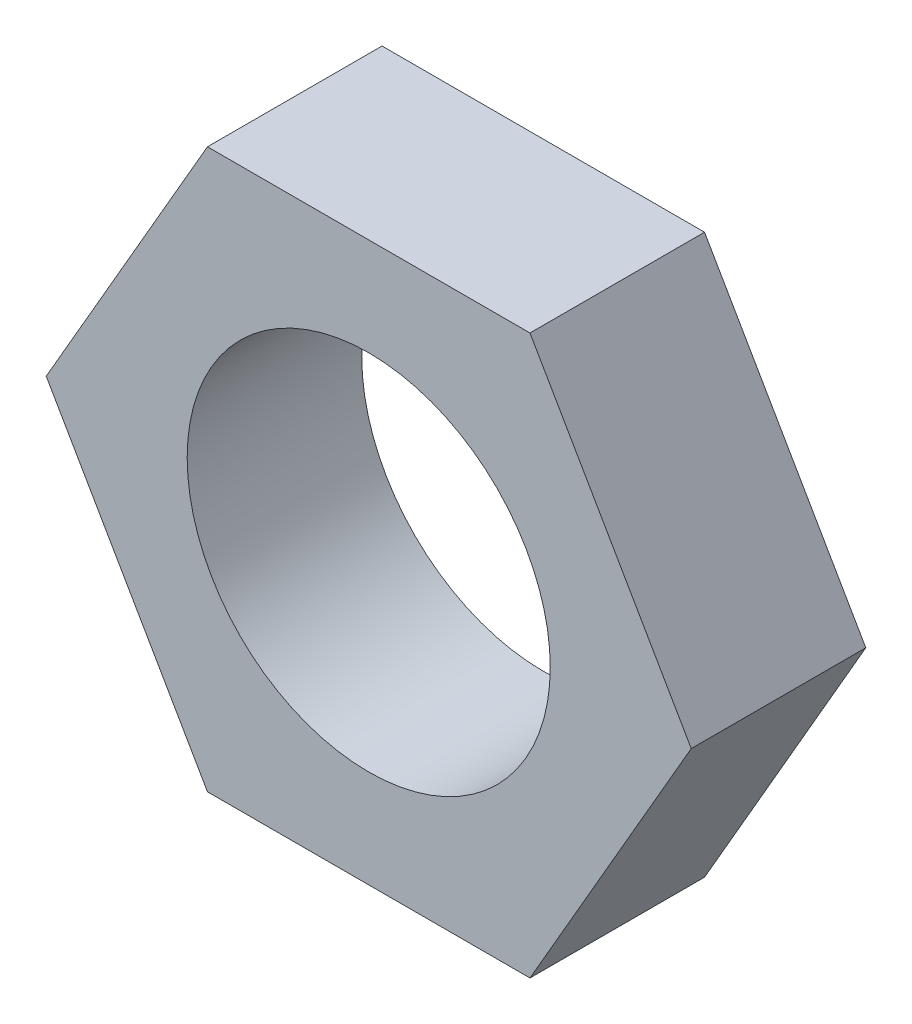
ISO-10303-21;
HEADER;
FILE_DESCRIPTION(('STEP AP214'),'2;1');
FILE_NAME('part.step','',(''),(''),'','','');
FILE_SCHEMA(('AUTOMOTIVE_DESIGN { 1 0 10303 214 1 1 1 1 }'));
ENDSEC;
DATA;
#1=APPLICATION_CONTEXT('core data for automotive mechanical design processes');
#2=APPLICATION_PROTOCOL_DEFINITION('international standard','automotive_design',2000,#1);
#3=PRODUCT_CONTEXT('',#1,'mechanical');
#4=PRODUCT('Part','Part','',(#3));
#5=PRODUCT_RELATED_PRODUCT_CATEGORY('part','',(#4));
#6=PRODUCT_DEFINITION_FORMATION('','',#4);
#7=PRODUCT_DEFINITION_CONTEXT('part definition',#1,'design');
#8=PRODUCT_DEFINITION('design','',#6,#7);
#9=PRODUCT_DEFINITION_SHAPE('','',#8);
#10=(LENGTH_UNIT() NAMED_UNIT(*) SI_UNIT(.MILLI.,.METRE.));
#11=(NAMED_UNIT(*) PLANE_ANGLE_UNIT() SI_UNIT($,.RADIAN.));
#12=(NAMED_UNIT(*) SI_UNIT($,.STERADIAN.) SOLID_ANGLE_UNIT());
#13=UNCERTAINTY_MEASURE_WITH_UNIT(LENGTH_MEASURE(1.E-05),#10,'distance_accuracy_value','');
#14=(GEOMETRIC_REPRESENTATION_CONTEXT(3) GLOBAL_UNCERTAINTY_ASSIGNED_CONTEXT((#13)) GLOBAL_UNIT_ASSIGNED_CONTEXT((#10,
#11,#12)) REPRESENTATION_CONTEXT('',''));
#15=CARTESIAN_POINT('',(0.,0.,0.));
#16=DIRECTION('',(0.,0.,1.));
#17=DIRECTION('',(1.,0.,0.));
#18=AXIS2_PLACEMENT_3D('',#15,#16,#17);
#19=CARTESIAN_POINT('',(0.,0.,2.5));
#20=DIRECTION('',(0.,0.,1.));
#21=DIRECTION('',(1.,0.,0.));
#22=AXIS2_PLACEMENT_3D('',#19,#20,#21);
#23=PLANE('',#22);
#24=DIRECTION('',(0.5,0.866025403784439,0.));
#25=VECTOR('',#24,1.);
#26=CARTESIAN_POINT('',(2.3094010767585,-4.,2.5));
#27=LINE('',#26,#25);
#28=CARTESIAN_POINT('',(2.3094010767585,-4.,2.5));
#29=VERTEX_POINT('',#28);
#30=CARTESIAN_POINT('',(4.61880215351701,0.,2.5));
#31=VERTEX_POINT('',#30);
#32=EDGE_CURVE('E137',#29,#31,#27,.T.);
#33=ORIENTED_EDGE('',*,*,#32,.T.);
#34=DIRECTION('',(-0.5,0.866025403784439,0.));
#35=VECTOR('',#34,1.);
#36=CARTESIAN_POINT('',(4.61880215351701,0.,2.5));
#37=LINE('',#36,#35);
#38=CARTESIAN_POINT('',(2.3094010767585,4.,2.5));
#39=VERTEX_POINT('',#38);
#40=EDGE_CURVE('E95',#31,#39,#37,.T.);
#41=ORIENTED_EDGE('',*,*,#40,.T.);
#42=DIRECTION('',(-1.,0.,0.));
#43=VECTOR('',#42,1.);
#44=CARTESIAN_POINT('',(2.3094010767585,4.,2.5));
#45=LINE('',#44,#43);
#46=CARTESIAN_POINT('',(-2.3094010767585,4.,2.5));
#47=VERTEX_POINT('',#46);
#48=EDGE_CURVE('E108',#39,#47,#45,.T.);
#49=ORIENTED_EDGE('',*,*,#48,.T.);
#50=DIRECTION('',(-0.5,-0.866025403784439,0.));
#51=VECTOR('',#50,1.);
#52=CARTESIAN_POINT('',(-2.3094010767585,4.,2.5));
#53=LINE('',#52,#51);
#54=CARTESIAN_POINT('',(-4.61880215351701,0.,2.5));
#55=VERTEX_POINT('',#54);
#56=EDGE_CURVE('E102',#47,#55,#53,.T.);
#57=ORIENTED_EDGE('',*,*,#56,.T.);
#58=DIRECTION('',(0.5,-0.866025403784439,0.));
#59=VECTOR('',#58,1.);
#60=CARTESIAN_POINT('',(-4.61880215351701,0.,2.5));
#61=LINE('',#60,#59);
#62=CARTESIAN_POINT('',(-2.30940107675851,-4.,2.5));
#63=VERTEX_POINT('',#62);
#64=EDGE_CURVE('E106',#55,#63,#61,.T.);
#65=ORIENTED_EDGE('',*,*,#64,.T.);
#66=DIRECTION('',(1.,0.,0.));
#67=VECTOR('',#66,1.);
#68=CARTESIAN_POINT('',(-2.30940107675851,-4.,2.5));
#69=LINE('',#68,#67);
#70=EDGE_CURVE('E58',#63,#29,#69,.T.);
#71=ORIENTED_EDGE('',*,*,#70,.T.);
#72=EDGE_LOOP('',(#33,#41,#49,#57,#65,#71));
#73=FACE_BOUND('',#72,.T.);
#74=CARTESIAN_POINT('',(0.,0.,2.5));
#75=DIRECTION('',(0.,0.,1.));
#76=DIRECTION('',(1.,0.,0.));
#77=AXIS2_PLACEMENT_3D('',#74,#75,#76);
#78=CIRCLE('',#77,2.6);
#79=CARTESIAN_POINT('',(2.6,0.,2.5));
#80=VERTEX_POINT('',#79);
#81=EDGE_CURVE('E130',#80,#80,#78,.T.);
#82=ORIENTED_EDGE('',*,*,#81,.F.);
#83=EDGE_LOOP('',(#82));
#84=FACE_BOUND('',#83,.T.);
#85=ADVANCED_FACE('F41',(#73,#84),#23,.T.);
#86=CARTESIAN_POINT('',(0.,0.,0.));
#87=DIRECTION('',(0.,0.,1.));
#88=DIRECTION('',(1.,0.,0.));
#89=AXIS2_PLACEMENT_3D('',#86,#87,#88);
#90=PLANE('',#89);
#91=DIRECTION('',(0.5,0.866025403784439,0.));
#92=VECTOR('',#91,1.);
#93=CARTESIAN_POINT('',(2.3094010767585,-4.,0.));
#94=LINE('',#93,#92);
#95=CARTESIAN_POINT('',(2.3094010767585,-4.,0.));
#96=VERTEX_POINT('',#95);
#97=CARTESIAN_POINT('',(4.61880215351701,0.,0.));
#98=VERTEX_POINT('',#97);
#99=EDGE_CURVE('E126',#96,#98,#94,.T.);
#100=ORIENTED_EDGE('',*,*,#99,.F.);
#101=DIRECTION('',(1.,0.,0.));
#102=VECTOR('',#101,1.);
#103=CARTESIAN_POINT('',(-2.30940107675851,-4.,0.));
#104=LINE('',#103,#102);
#105=CARTESIAN_POINT('',(-2.30940107675851,-4.,0.));
#106=VERTEX_POINT('',#105);
#107=EDGE_CURVE('E87',#106,#96,#104,.T.);
#108=ORIENTED_EDGE('',*,*,#107,.F.);
#109=DIRECTION('',(0.5,-0.866025403784439,0.));
#110=VECTOR('',#109,1.);
#111=CARTESIAN_POINT('',(-4.61880215351701,0.,0.));
#112=LINE('',#111,#110);
#113=CARTESIAN_POINT('',(-4.61880215351701,0.,0.));
#114=VERTEX_POINT('',#113);
#115=EDGE_CURVE('E81',#114,#106,#112,.T.);
#116=ORIENTED_EDGE('',*,*,#115,.F.);
#117=DIRECTION('',(-0.5,-0.866025403784439,0.));
#118=VECTOR('',#117,1.);
#119=CARTESIAN_POINT('',(-2.3094010767585,4.,0.));
#120=LINE('',#119,#118);
#121=CARTESIAN_POINT('',(-2.3094010767585,4.,0.));
#122=VERTEX_POINT('',#121);
#123=EDGE_CURVE('E116',#122,#114,#120,.T.);
#124=ORIENTED_EDGE('',*,*,#123,.F.);
#125=DIRECTION('',(-1.,0.,0.));
#126=VECTOR('',#125,1.);
#127=CARTESIAN_POINT('',(2.3094010767585,4.,0.));
#128=LINE('',#127,#126);
#129=CARTESIAN_POINT('',(2.3094010767585,4.,0.));
#130=VERTEX_POINT('',#129);
#131=EDGE_CURVE('E132',#130,#122,#128,.T.);
#132=ORIENTED_EDGE('',*,*,#131,.F.);
#133=DIRECTION('',(-0.5,0.866025403784439,0.));
#134=VECTOR('',#133,1.);
#135=CARTESIAN_POINT('',(4.61880215351701,0.,0.));
#136=LINE('',#135,#134);
#137=EDGE_CURVE('E129',#98,#130,#136,.T.);
#138=ORIENTED_EDGE('',*,*,#137,.F.);
#139=EDGE_LOOP('',(#100,#108,#116,#124,#132,#138));
#140=FACE_BOUND('',#139,.T.);
#141=CARTESIAN_POINT('',(0.,0.,0.));
#142=DIRECTION('',(0.,0.,1.));
#143=DIRECTION('',(1.,0.,0.));
#144=AXIS2_PLACEMENT_3D('',#141,#142,#143);
#145=CIRCLE('',#144,2.6);
#146=CARTESIAN_POINT('',(2.6,0.,0.));
#147=VERTEX_POINT('',#146);
#148=EDGE_CURVE('E248',#147,#147,#145,.T.);
#149=ORIENTED_EDGE('',*,*,#148,.T.);
#150=EDGE_LOOP('',(#149));
#151=FACE_BOUND('',#150,.T.);
#152=ADVANCED_FACE('F146',(#140,#151),#90,.F.);
#153=CARTESIAN_POINT('',(2.3094010767585,-4.,2.5));
#154=DIRECTION('',(-0.866025403784439,0.5,0.));
#155=DIRECTION('',(-0.5,-0.866025403784439,0.));
#156=AXIS2_PLACEMENT_3D('',#153,#154,#155);
#157=PLANE('',#156);
#158=ORIENTED_EDGE('',*,*,#99,.T.);
#159=DIRECTION('',(0.,0.,-1.));
#160=VECTOR('',#159,1.);
#161=CARTESIAN_POINT('',(4.61880215351701,0.,2.5));
#162=LINE('',#161,#160);
#163=EDGE_CURVE('E11',#31,#98,#162,.T.);
#164=ORIENTED_EDGE('',*,*,#163,.F.);
#165=ORIENTED_EDGE('',*,*,#32,.F.);
#166=DIRECTION('',(0.,0.,-1.));
#167=VECTOR('',#166,1.);
#168=CARTESIAN_POINT('',(2.3094010767585,-4.,2.5));
#169=LINE('',#168,#167);
#170=EDGE_CURVE('E122',#29,#96,#169,.T.);
#171=ORIENTED_EDGE('',*,*,#170,.T.);
#172=EDGE_LOOP('',(#158,#164,#165,#171));
#173=FACE_BOUND('',#172,.T.);
#174=ADVANCED_FACE('F43',(#173),#157,.F.);
#175=CARTESIAN_POINT('',(4.61880215351701,0.,2.5));
#176=DIRECTION('',(-0.866025403784439,-0.5,0.));
#177=DIRECTION('',(0.5,-0.866025403784439,0.));
#178=AXIS2_PLACEMENT_3D('',#175,#176,#177);
#179=PLANE('',#178);
#180=ORIENTED_EDGE('',*,*,#137,.T.);
#181=DIRECTION('',(0.,0.,-1.));
#182=VECTOR('',#181,1.);
#183=CARTESIAN_POINT('',(2.3094010767585,4.,2.5));
#184=LINE('',#183,#182);
#185=EDGE_CURVE('E50',#39,#130,#184,.T.);
#186=ORIENTED_EDGE('',*,*,#185,.F.);
#187=ORIENTED_EDGE('',*,*,#40,.F.);
#188=ORIENTED_EDGE('',*,*,#163,.T.);
#189=EDGE_LOOP('',(#180,#186,#187,#188));
#190=FACE_BOUND('',#189,.T.);
#191=ADVANCED_FACE('F171',(#190),#179,.F.);
#192=CARTESIAN_POINT('',(2.3094010767585,4.,2.5));
#193=DIRECTION('',(0.,-1.,0.));
#194=DIRECTION('',(1.,0.,0.));
#195=AXIS2_PLACEMENT_3D('',#192,#193,#194);
#196=PLANE('',#195);
#197=ORIENTED_EDGE('',*,*,#131,.T.);
#198=DIRECTION('',(0.,0.,-1.));
#199=VECTOR('',#198,1.);
#200=CARTESIAN_POINT('',(-2.3094010767585,4.,2.5));
#201=LINE('',#200,#199);
#202=EDGE_CURVE('E117',#47,#122,#201,.T.);
#203=ORIENTED_EDGE('',*,*,#202,.F.);
#204=ORIENTED_EDGE('',*,*,#48,.F.);
#205=ORIENTED_EDGE('',*,*,#185,.T.);
#206=EDGE_LOOP('',(#197,#203,#204,#205));
#207=FACE_BOUND('',#206,.T.);
#208=ADVANCED_FACE('F143',(#207),#196,.F.);
#209=CARTESIAN_POINT('',(-2.3094010767585,4.,2.5));
#210=DIRECTION('',(0.866025403784438,-0.5,0.));
#211=DIRECTION('',(0.5,0.866025403784439,0.));
#212=AXIS2_PLACEMENT_3D('',#209,#210,#211);
#213=PLANE('',#212);
#214=ORIENTED_EDGE('',*,*,#123,.T.);
#215=DIRECTION('',(0.,0.,-1.));
#216=VECTOR('',#215,1.);
#217=CARTESIAN_POINT('',(-4.61880215351701,0.,2.5));
#218=LINE('',#217,#216);
#219=EDGE_CURVE('E113',#55,#114,#218,.T.);
#220=ORIENTED_EDGE('',*,*,#219,.F.);
#221=ORIENTED_EDGE('',*,*,#56,.F.);
#222=ORIENTED_EDGE('',*,*,#202,.T.);
#223=EDGE_LOOP('',(#214,#220,#221,#222));
#224=FACE_BOUND('',#223,.T.);
#225=ADVANCED_FACE('F114',(#224),#213,.F.);
#226=CARTESIAN_POINT('',(-4.61880215351701,0.,2.5));
#227=DIRECTION('',(0.866025403784439,0.5,0.));
#228=DIRECTION('',(-0.5,0.866025403784439,0.));
#229=AXIS2_PLACEMENT_3D('',#226,#227,#228);
#230=PLANE('',#229);
#231=ORIENTED_EDGE('',*,*,#115,.T.);
#232=DIRECTION('',(0.,0.,-1.));
#233=VECTOR('',#232,1.);
#234=CARTESIAN_POINT('',(-2.30940107675851,-4.,2.5));
#235=LINE('',#234,#233);
#236=EDGE_CURVE('E118',#63,#106,#235,.T.);
#237=ORIENTED_EDGE('',*,*,#236,.F.);
#238=ORIENTED_EDGE('',*,*,#64,.F.);
#239=ORIENTED_EDGE('',*,*,#219,.T.);
#240=EDGE_LOOP('',(#231,#237,#238,#239));
#241=FACE_BOUND('',#240,.T.);
#242=ADVANCED_FACE('F120',(#241),#230,.F.);
#243=CARTESIAN_POINT('',(-2.30940107675851,-4.,2.5));
#244=DIRECTION('',(0.,1.,0.));
#245=DIRECTION('',(0.,0.,1.));
#246=AXIS2_PLACEMENT_3D('',#243,#244,#245);
#247=PLANE('',#246);
#248=ORIENTED_EDGE('',*,*,#107,.T.);
#249=ORIENTED_EDGE('',*,*,#170,.F.);
#250=ORIENTED_EDGE('',*,*,#70,.F.);
#251=ORIENTED_EDGE('',*,*,#236,.T.);
#252=EDGE_LOOP('',(#248,#249,#250,#251));
#253=FACE_BOUND('',#252,.T.);
#254=ADVANCED_FACE('F151',(#253),#247,.F.);
#255=CARTESIAN_POINT('',(0.,0.,2.5));
#256=DIRECTION('',(0.,0.,-1.));
#257=DIRECTION('',(-1.,0.,0.));
#258=AXIS2_PLACEMENT_3D('',#255,#256,#257);
#259=CYLINDRICAL_SURFACE('',#258,2.6);
#260=ORIENTED_EDGE('',*,*,#81,.T.);
#261=EDGE_LOOP('',(#260));
#262=FACE_BOUND('',#261,.T.);
#263=ORIENTED_EDGE('',*,*,#148,.F.);
#264=EDGE_LOOP('',(#263));
#265=FACE_BOUND('',#264,.T.);
#266=ADVANCED_FACE('F153',(#262,#265),#259,.F.);
#267=CLOSED_SHELL('',(#85,#152,#174,#191,#208,#225,#242,#254,#266));
#268=MANIFOLD_SOLID_BREP('B2',#267);
#269=ADVANCED_BREP_SHAPE_REPRESENTATION('',(#18,#268),#14);
#270=SHAPE_DEFINITION_REPRESENTATION(#9,#269);
ENDSEC;
END-ISO-10303-21;
